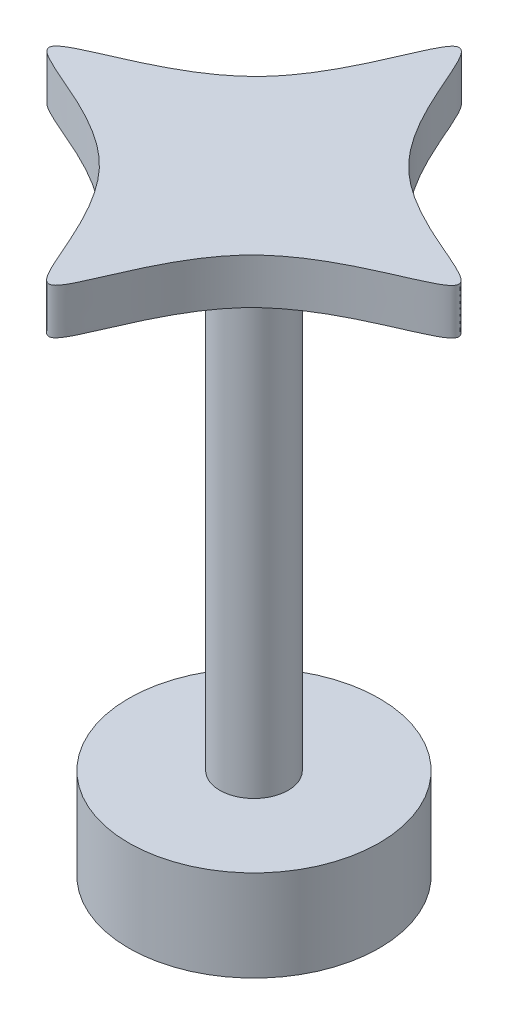
ISO-10303-21;
HEADER;
FILE_DESCRIPTION(('STEP AP214'),'2;1');
FILE_NAME('part.step','',(''),(''),'','','');
FILE_SCHEMA(('AUTOMOTIVE_DESIGN { 1 0 10303 214 1 1 1 1 }'));
ENDSEC;
DATA;
#1=APPLICATION_CONTEXT('core data for automotive mechanical design processes');
#2=APPLICATION_PROTOCOL_DEFINITION('international standard','automotive_design',2000,#1);
#3=PRODUCT_CONTEXT('',#1,'mechanical');
#4=PRODUCT('Part','Part','',(#3));
#5=PRODUCT_RELATED_PRODUCT_CATEGORY('part','',(#4));
#6=PRODUCT_DEFINITION_FORMATION('','',#4);
#7=PRODUCT_DEFINITION_CONTEXT('part definition',#1,'design');
#8=PRODUCT_DEFINITION('design','',#6,#7);
#9=PRODUCT_DEFINITION_SHAPE('','',#8);
#10=(LENGTH_UNIT() NAMED_UNIT(*) SI_UNIT(.MILLI.,.METRE.));
#11=(NAMED_UNIT(*) PLANE_ANGLE_UNIT() SI_UNIT($,.RADIAN.));
#12=(NAMED_UNIT(*) SI_UNIT($,.STERADIAN.) SOLID_ANGLE_UNIT());
#13=UNCERTAINTY_MEASURE_WITH_UNIT(LENGTH_MEASURE(1.E-05),#10,'distance_accuracy_value','');
#14=(GEOMETRIC_REPRESENTATION_CONTEXT(3) GLOBAL_UNCERTAINTY_ASSIGNED_CONTEXT((#13)) GLOBAL_UNIT_ASSIGNED_CONTEXT((#10,
#11,#12)) REPRESENTATION_CONTEXT('',''));
#15=CARTESIAN_POINT('',(0.,0.,0.));
#16=DIRECTION('',(0.,0.,1.));
#17=DIRECTION('',(1.,0.,0.));
#18=AXIS2_PLACEMENT_3D('',#15,#16,#17);
#19=CARTESIAN_POINT('',(0.,12.7,0.));
#20=DIRECTION('',(0.,-1.,0.));
#21=DIRECTION('',(0.,0.,-1.));
#22=AXIS2_PLACEMENT_3D('',#19,#20,#21);
#23=CYLINDRICAL_SURFACE('',#22,17.4625);
#24=CARTESIAN_POINT('',(0.,12.7,0.));
#25=DIRECTION('',(0.,1.,0.));
#26=DIRECTION('',(0.,0.,1.));
#27=AXIS2_PLACEMENT_3D('',#24,#25,#26);
#28=CIRCLE('',#27,17.4625);
#29=CARTESIAN_POINT('',(0.,12.7,17.4625));
#30=VERTEX_POINT('',#29);
#31=EDGE_CURVE('E43',#30,#30,#28,.T.);
#32=ORIENTED_EDGE('',*,*,#31,.F.);
#33=EDGE_LOOP('',(#32));
#34=FACE_BOUND('',#33,.T.);
#35=CARTESIAN_POINT('',(0.,0.,0.));
#36=DIRECTION('',(0.,1.,0.));
#37=DIRECTION('',(0.,0.,1.));
#38=AXIS2_PLACEMENT_3D('',#35,#36,#37);
#39=CIRCLE('',#38,17.4625);
#40=CARTESIAN_POINT('',(0.,0.,17.4625));
#41=VERTEX_POINT('',#40);
#42=EDGE_CURVE('E39',#41,#41,#39,.T.);
#43=ORIENTED_EDGE('',*,*,#42,.T.);
#44=EDGE_LOOP('',(#43));
#45=FACE_BOUND('',#44,.T.);
#46=ADVANCED_FACE('F36',(#34,#45),#23,.T.);
#47=CARTESIAN_POINT('',(0.,12.7,0.));
#48=DIRECTION('',(0.,1.,0.));
#49=DIRECTION('',(0.,0.,1.));
#50=AXIS2_PLACEMENT_3D('',#47,#48,#49);
#51=PLANE('',#50);
#52=CARTESIAN_POINT('',(0.,12.7,0.));
#53=DIRECTION('',(0.,1.,0.));
#54=DIRECTION('',(0.,0.,1.));
#55=AXIS2_PLACEMENT_3D('',#52,#53,#54);
#56=CIRCLE('',#55,4.7625);
#57=CARTESIAN_POINT('',(0.,12.7,4.7625));
#58=VERTEX_POINT('',#57);
#59=EDGE_CURVE('E10',#58,#58,#56,.T.);
#60=ORIENTED_EDGE('',*,*,#59,.F.);
#61=EDGE_LOOP('',(#60));
#62=FACE_BOUND('',#61,.T.);
#63=ORIENTED_EDGE('',*,*,#31,.T.);
#64=EDGE_LOOP('',(#63));
#65=FACE_BOUND('',#64,.T.);
#66=ADVANCED_FACE('F82',(#62,#65),#51,.T.);
#67=CARTESIAN_POINT('',(0.,0.,0.));
#68=DIRECTION('',(0.,1.,0.));
#69=DIRECTION('',(0.,0.,1.));
#70=AXIS2_PLACEMENT_3D('',#67,#68,#69);
#71=PLANE('',#70);
#72=ORIENTED_EDGE('',*,*,#42,.F.);
#73=EDGE_LOOP('',(#72));
#74=FACE_BOUND('',#73,.T.);
#75=ADVANCED_FACE('F80',(#74),#71,.F.);
#76=CARTESIAN_POINT('',(0.,79.375,0.));
#77=DIRECTION('',(0.,-1.,0.));
#78=DIRECTION('',(0.,0.,-1.));
#79=AXIS2_PLACEMENT_3D('',#76,#77,#78);
#80=CYLINDRICAL_SURFACE('',#79,4.7625);
#81=CARTESIAN_POINT('',(0.,79.375,0.));
#82=DIRECTION('',(0.,1.,0.));
#83=DIRECTION('',(0.,0.,1.));
#84=AXIS2_PLACEMENT_3D('',#81,#82,#83);
#85=CIRCLE('',#84,4.7625);
#86=CARTESIAN_POINT('',(0.,79.375,4.7625));
#87=VERTEX_POINT('',#86);
#88=EDGE_CURVE('E49',#87,#87,#85,.T.);
#89=ORIENTED_EDGE('',*,*,#88,.F.);
#90=EDGE_LOOP('',(#89));
#91=FACE_BOUND('',#90,.T.);
#92=ORIENTED_EDGE('',*,*,#59,.T.);
#93=EDGE_LOOP('',(#92));
#94=FACE_BOUND('',#93,.T.);
#95=ADVANCED_FACE('F74',(#91,#94),#80,.T.);
#96=CARTESIAN_POINT('',(-10.558892025305,85.725,-10.9894221503203));
#97=CARTESIAN_POINT('',(-17.2398414896802,85.725,-4.23258041615468));
#98=CARTESIAN_POINT('',(-39.7516062052051,85.725,-0.034148922483641));
#99=CARTESIAN_POINT('',(-6.30197178868742,85.725,6.14387582892803));
#100=CARTESIAN_POINT('',(-0.034148922483643,85.725,39.7516062052051));
#101=CARTESIAN_POINT('',(6.14387582892803,85.725,6.30197178868742));
#102=CARTESIAN_POINT('',(39.7516062052051,85.725,0.0341489224836482));
#103=CARTESIAN_POINT('',(6.30197178868743,85.725,-6.14387582892803));
#104=CARTESIAN_POINT('',(0.0341489224836388,85.725,-39.7516062052051));
#105=CARTESIAN_POINT('',(-4.06512093821371,85.725,-17.5569592537431));
#106=CARTESIAN_POINT('',(-10.558892025305,85.725,-10.9894221503203));
#107=B_SPLINE_CURVE_WITH_KNOTS('',3,(#96,#97,#98,#99,#100,#101,#102,#103,#104,#105,#106),
.UNSPECIFIED.,.T.,.F.,(4,1,1,1,1,1,1,1,4),(0.,0.126775923600738,0.25,0.376775923600738,0.5,
0.626775923600738,0.75,0.876775923600738,1.),.UNSPECIFIED.);
#108=DIRECTION('',(0.,-1.,0.));
#109=VECTOR('',#108,1.);
#110=SURFACE_OF_LINEAR_EXTRUSION('',#107,#109);
#111=CARTESIAN_POINT('',(-10.558892025305,85.725,-10.9894221503203));
#112=VERTEX_POINT('',#111);
#113=EDGE_CURVE('E52',#112,#112,#107,.T.);
#114=ORIENTED_EDGE('',*,*,#113,.F.);
#115=EDGE_LOOP('',(#114));
#116=FACE_BOUND('',#115,.T.);
#117=CARTESIAN_POINT('',(-10.558892025305,79.375,-10.9894221503203));
#118=CARTESIAN_POINT('',(-17.2398414896802,79.375,-4.23258041615468));
#119=CARTESIAN_POINT('',(-39.7516062052051,79.375,-0.034148922483641));
#120=CARTESIAN_POINT('',(-6.30197178868742,79.375,6.14387582892803));
#121=CARTESIAN_POINT('',(-0.034148922483643,79.375,39.7516062052051));
#122=CARTESIAN_POINT('',(6.14387582892803,79.375,6.30197178868742));
#123=CARTESIAN_POINT('',(39.7516062052051,79.375,0.0341489224836482));
#124=CARTESIAN_POINT('',(6.30197178868743,79.375,-6.14387582892803));
#125=CARTESIAN_POINT('',(0.0341489224836388,79.375,-39.7516062052051));
#126=CARTESIAN_POINT('',(-4.06512093821371,79.375,-17.5569592537431));
#127=CARTESIAN_POINT('',(-10.558892025305,79.375,-10.9894221503203));
#128=B_SPLINE_CURVE_WITH_KNOTS('',3,(#117,#118,#119,#120,#121,#122,#123,#124,#125,#126,#127),
.UNSPECIFIED.,.T.,.F.,(4,1,1,1,1,1,1,1,4),(0.,0.126775923600738,0.25,0.376775923600738,0.5,
0.626775923600738,0.75,0.876775923600738,1.),.UNSPECIFIED.);
#129=CARTESIAN_POINT('',(-10.558892025305,79.375,-10.9894221503203));
#130=VERTEX_POINT('',#129);
#131=EDGE_CURVE('E53',#130,#130,#128,.T.);
#132=ORIENTED_EDGE('',*,*,#131,.T.);
#133=EDGE_LOOP('',(#132));
#134=FACE_BOUND('',#133,.T.);
#135=ADVANCED_FACE('F69',(#116,#134),#110,.F.);
#136=CARTESIAN_POINT('',(10.558892025305,85.725,10.9894221503203));
#137=DIRECTION('',(0.,-1.,0.));
#138=DIRECTION('',(0.,0.,-1.));
#139=AXIS2_PLACEMENT_3D('',#136,#137,#138);
#140=PLANE('',#139);
#141=ORIENTED_EDGE('',*,*,#113,.T.);
#142=EDGE_LOOP('',(#141));
#143=FACE_BOUND('',#142,.T.);
#144=ADVANCED_FACE('F73',(#143),#140,.F.);
#145=CARTESIAN_POINT('',(10.558892025305,79.375,10.9894221503203));
#146=DIRECTION('',(0.,-1.,0.));
#147=DIRECTION('',(0.,0.,-1.));
#148=AXIS2_PLACEMENT_3D('',#145,#146,#147);
#149=PLANE('',#148);
#150=ORIENTED_EDGE('',*,*,#88,.T.);
#151=EDGE_LOOP('',(#150));
#152=FACE_BOUND('',#151,.T.);
#153=ORIENTED_EDGE('',*,*,#131,.F.);
#154=EDGE_LOOP('',(#153));
#155=FACE_BOUND('',#154,.T.);
#156=ADVANCED_FACE('F76',(#152,#155),#149,.T.);
#157=CLOSED_SHELL('',(#46,#66,#75,#95,#135,#144,#156));
#158=MANIFOLD_SOLID_BREP('B2',#157);
#159=ADVANCED_BREP_SHAPE_REPRESENTATION('',(#18,#158),#14);
#160=SHAPE_DEFINITION_REPRESENTATION(#9,#159);
ENDSEC;
END-ISO-10303-21;
